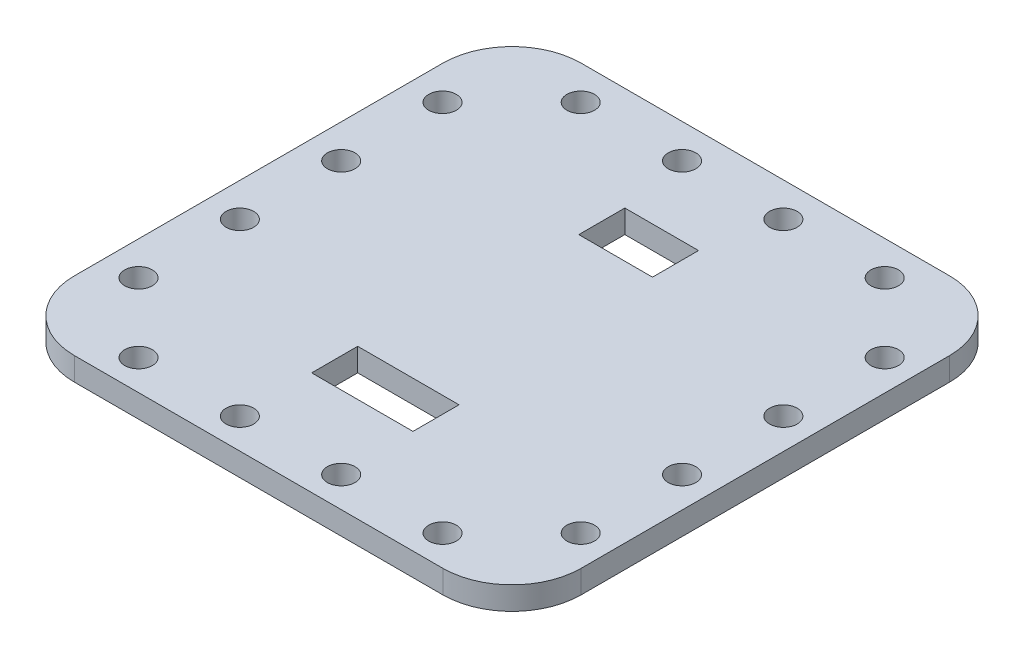
ISO-10303-21;
HEADER;
FILE_DESCRIPTION(('STEP AP214'),'2;1');
FILE_NAME('part.step','',(''),(''),'','','');
FILE_SCHEMA(('AUTOMOTIVE_DESIGN { 1 0 10303 214 1 1 1 1 }'));
ENDSEC;
DATA;
#1=APPLICATION_CONTEXT('core data for automotive mechanical design processes');
#2=APPLICATION_PROTOCOL_DEFINITION('international standard','automotive_design',2000,#1);
#3=PRODUCT_CONTEXT('',#1,'mechanical');
#4=PRODUCT('Part','Part','',(#3));
#5=PRODUCT_RELATED_PRODUCT_CATEGORY('part','',(#4));
#6=PRODUCT_DEFINITION_FORMATION('','',#4);
#7=PRODUCT_DEFINITION_CONTEXT('part definition',#1,'design');
#8=PRODUCT_DEFINITION('design','',#6,#7);
#9=PRODUCT_DEFINITION_SHAPE('','',#8);
#10=(LENGTH_UNIT() NAMED_UNIT(*) SI_UNIT(.MILLI.,.METRE.));
#11=(NAMED_UNIT(*) PLANE_ANGLE_UNIT() SI_UNIT($,.RADIAN.));
#12=(NAMED_UNIT(*) SI_UNIT($,.STERADIAN.) SOLID_ANGLE_UNIT());
#13=UNCERTAINTY_MEASURE_WITH_UNIT(LENGTH_MEASURE(1.E-05),#10,'distance_accuracy_value','');
#14=(GEOMETRIC_REPRESENTATION_CONTEXT(3) GLOBAL_UNCERTAINTY_ASSIGNED_CONTEXT((#13)) GLOBAL_UNIT_ASSIGNED_CONTEXT((#10,
#11,#12)) REPRESENTATION_CONTEXT('',''));
#15=CARTESIAN_POINT('',(0.,0.,0.));
#16=DIRECTION('',(0.,0.,1.));
#17=DIRECTION('',(1.,0.,0.));
#18=AXIS2_PLACEMENT_3D('',#15,#16,#17);
#19=CARTESIAN_POINT('',(40.,5.,55.));
#20=DIRECTION('',(0.,1.,0.));
#21=DIRECTION('',(0.,0.,1.));
#22=AXIS2_PLACEMENT_3D('',#19,#20,#21);
#23=PLANE('',#22);
#24=DIRECTION('',(0.,0.,1.));
#25=VECTOR('',#24,1.);
#26=CARTESIAN_POINT('',(-11.,5.,22.5));
#27=LINE('',#26,#25);
#28=CARTESIAN_POINT('',(-11.,5.,22.5));
#29=VERTEX_POINT('',#28);
#30=CARTESIAN_POINT('',(-11.,5.,32.5));
#31=VERTEX_POINT('',#30);
#32=EDGE_CURVE('E57',#29,#31,#27,.T.);
#33=ORIENTED_EDGE('',*,*,#32,.F.);
#34=DIRECTION('',(-1.,0.,0.));
#35=VECTOR('',#34,1.);
#36=CARTESIAN_POINT('',(-11.,5.,22.5));
#37=LINE('',#36,#35);
#38=CARTESIAN_POINT('',(11.,5.,22.5));
#39=VERTEX_POINT('',#38);
#40=EDGE_CURVE('E173',#39,#29,#37,.T.);
#41=ORIENTED_EDGE('',*,*,#40,.F.);
#42=DIRECTION('',(0.,0.,-1.));
#43=VECTOR('',#42,1.);
#44=CARTESIAN_POINT('',(11.,5.,22.5));
#45=LINE('',#44,#43);
#46=CARTESIAN_POINT('',(11.,5.,32.5));
#47=VERTEX_POINT('',#46);
#48=EDGE_CURVE('E176',#47,#39,#45,.T.);
#49=ORIENTED_EDGE('',*,*,#48,.F.);
#50=DIRECTION('',(1.,0.,0.));
#51=VECTOR('',#50,1.);
#52=CARTESIAN_POINT('',(-11.,5.,32.5));
#53=LINE('',#52,#51);
#54=EDGE_CURVE('E182',#31,#47,#53,.T.);
#55=ORIENTED_EDGE('',*,*,#54,.F.);
#56=EDGE_LOOP('',(#33,#41,#49,#55));
#57=FACE_BOUND('',#56,.T.);
#58=DIRECTION('',(0.,0.,1.));
#59=VECTOR('',#58,1.);
#60=CARTESIAN_POINT('',(-7.99999999999998,5.,-32.5));
#61=LINE('',#60,#59);
#62=CARTESIAN_POINT('',(-7.99999999999998,5.,-32.5));
#63=VERTEX_POINT('',#62);
#64=CARTESIAN_POINT('',(-7.99999999999997,5.,-22.5));
#65=VERTEX_POINT('',#64);
#66=EDGE_CURVE('E188',#63,#65,#61,.T.);
#67=ORIENTED_EDGE('',*,*,#66,.F.);
#68=DIRECTION('',(-1.,0.,0.));
#69=VECTOR('',#68,1.);
#70=CARTESIAN_POINT('',(-7.99999999999998,5.,-32.5));
#71=LINE('',#70,#69);
#72=CARTESIAN_POINT('',(8.00000000000002,5.,-32.5));
#73=VERTEX_POINT('',#72);
#74=EDGE_CURVE('E196',#73,#63,#71,.T.);
#75=ORIENTED_EDGE('',*,*,#74,.F.);
#76=DIRECTION('',(0.,0.,-1.));
#77=VECTOR('',#76,1.);
#78=CARTESIAN_POINT('',(8.00000000000002,5.,-32.5));
#79=LINE('',#78,#77);
#80=CARTESIAN_POINT('',(8.00000000000002,5.,-22.5));
#81=VERTEX_POINT('',#80);
#82=EDGE_CURVE('E210',#81,#73,#79,.T.);
#83=ORIENTED_EDGE('',*,*,#82,.F.);
#84=DIRECTION('',(1.,0.,0.));
#85=VECTOR('',#84,1.);
#86=CARTESIAN_POINT('',(-7.99999999999998,5.,-22.5));
#87=LINE('',#86,#85);
#88=EDGE_CURVE('E207',#65,#81,#87,.T.);
#89=ORIENTED_EDGE('',*,*,#88,.F.);
#90=EDGE_LOOP('',(#67,#75,#83,#89));
#91=FACE_BOUND('',#90,.T.);
#92=CARTESIAN_POINT('',(48.3346963055934,5.,-10.5816296180082));
#93=DIRECTION('',(0.,-1.,0.));
#94=DIRECTION('',(0.,0.,-1.));
#95=AXIS2_PLACEMENT_3D('',#92,#93,#94);
#96=CIRCLE('',#95,3.00000000000002);
#97=CARTESIAN_POINT('',(48.3346963055934,5.,-13.5816296180082));
#98=VERTEX_POINT('',#97);
#99=EDGE_CURVE('E277',#98,#98,#96,.T.);
#100=ORIENTED_EDGE('',*,*,#99,.T.);
#101=EDGE_LOOP('',(#100));
#102=FACE_BOUND('',#101,.T.);
#103=CARTESIAN_POINT('',(-32.6653036944065,5.,-47.5816296180083));
#104=DIRECTION('',(0.,-1.,0.));
#105=DIRECTION('',(0.,0.,-1.));
#106=AXIS2_PLACEMENT_3D('',#103,#104,#105);
#107=CIRCLE('',#106,3.00000000000001);
#108=CARTESIAN_POINT('',(-32.6653036944065,5.,-50.5816296180083));
#109=VERTEX_POINT('',#108);
#110=EDGE_CURVE('E289',#109,#109,#107,.T.);
#111=ORIENTED_EDGE('',*,*,#110,.T.);
#112=EDGE_LOOP('',(#111));
#113=FACE_BOUND('',#112,.T.);
#114=CARTESIAN_POINT('',(-47.6653036944066,5.,-32.5816296180082));
#115=DIRECTION('',(0.,-1.,0.));
#116=DIRECTION('',(0.,0.,-1.));
#117=AXIS2_PLACEMENT_3D('',#114,#115,#116);
#118=CIRCLE('',#117,3.);
#119=CARTESIAN_POINT('',(-47.6653036944066,5.,-35.5816296180082));
#120=VERTEX_POINT('',#119);
#121=EDGE_CURVE('E292',#120,#120,#118,.T.);
#122=ORIENTED_EDGE('',*,*,#121,.T.);
#123=EDGE_LOOP('',(#122));
#124=FACE_BOUND('',#123,.T.);
#125=CARTESIAN_POINT('',(-47.6653036944066,5.,-10.5816296180082));
#126=DIRECTION('',(0.,-1.,0.));
#127=DIRECTION('',(0.,0.,-1.));
#128=AXIS2_PLACEMENT_3D('',#125,#126,#127);
#129=CIRCLE('',#128,3.00000000000003);
#130=CARTESIAN_POINT('',(-47.6653036944066,5.,-13.5816296180083));
#131=VERTEX_POINT('',#130);
#132=EDGE_CURVE('E295',#131,#131,#129,.T.);
#133=ORIENTED_EDGE('',*,*,#132,.T.);
#134=EDGE_LOOP('',(#133));
#135=FACE_BOUND('',#134,.T.);
#136=CARTESIAN_POINT('',(-47.6653036944066,5.,11.4183703819918));
#137=DIRECTION('',(0.,-1.,0.));
#138=DIRECTION('',(0.,0.,-1.));
#139=AXIS2_PLACEMENT_3D('',#136,#137,#138);
#140=CIRCLE('',#139,2.99999999999997);
#141=CARTESIAN_POINT('',(-47.6653036944066,5.,8.4183703819918));
#142=VERTEX_POINT('',#141);
#143=EDGE_CURVE('E298',#142,#142,#140,.T.);
#144=ORIENTED_EDGE('',*,*,#143,.T.);
#145=EDGE_LOOP('',(#144));
#146=FACE_BOUND('',#145,.T.);
#147=CARTESIAN_POINT('',(-10.6653036944066,5.,48.4183703819918));
#148=DIRECTION('',(0.,-1.,0.));
#149=DIRECTION('',(0.,0.,-1.));
#150=AXIS2_PLACEMENT_3D('',#147,#148,#149);
#151=CIRCLE('',#150,3.00000000000002);
#152=CARTESIAN_POINT('',(-10.6653036944066,5.,45.4183703819917));
#153=VERTEX_POINT('',#152);
#154=EDGE_CURVE('E301',#153,#153,#151,.T.);
#155=ORIENTED_EDGE('',*,*,#154,.T.);
#156=EDGE_LOOP('',(#155));
#157=FACE_BOUND('',#156,.T.);
#158=CARTESIAN_POINT('',(11.3346963055934,5.,48.4183703819918));
#159=DIRECTION('',(0.,-1.,0.));
#160=DIRECTION('',(0.,0.,-1.));
#161=AXIS2_PLACEMENT_3D('',#158,#159,#160);
#162=CIRCLE('',#161,2.99999999999997);
#163=CARTESIAN_POINT('',(11.3346963055934,5.,45.4183703819918));
#164=VERTEX_POINT('',#163);
#165=EDGE_CURVE('E304',#164,#164,#162,.T.);
#166=ORIENTED_EDGE('',*,*,#165,.T.);
#167=EDGE_LOOP('',(#166));
#168=FACE_BOUND('',#167,.T.);
#169=CARTESIAN_POINT('',(33.3346963055934,5.,48.4183703819918));
#170=DIRECTION('',(0.,-1.,0.));
#171=DIRECTION('',(0.,0.,-1.));
#172=AXIS2_PLACEMENT_3D('',#169,#170,#171);
#173=CIRCLE('',#172,3.00000000000001);
#174=CARTESIAN_POINT('',(33.3346963055934,5.,45.4183703819917));
#175=VERTEX_POINT('',#174);
#176=EDGE_CURVE('E307',#175,#175,#173,.T.);
#177=ORIENTED_EDGE('',*,*,#176,.T.);
#178=EDGE_LOOP('',(#177));
#179=FACE_BOUND('',#178,.T.);
#180=CARTESIAN_POINT('',(48.3346963055934,5.,11.4183703819918));
#181=DIRECTION('',(0.,-1.,0.));
#182=DIRECTION('',(0.,0.,-1.));
#183=AXIS2_PLACEMENT_3D('',#180,#181,#182);
#184=CIRCLE('',#183,2.99999999999997);
#185=CARTESIAN_POINT('',(48.3346963055934,5.,8.4183703819918));
#186=VERTEX_POINT('',#185);
#187=EDGE_CURVE('E310',#186,#186,#184,.T.);
#188=ORIENTED_EDGE('',*,*,#187,.T.);
#189=EDGE_LOOP('',(#188));
#190=FACE_BOUND('',#189,.T.);
#191=CARTESIAN_POINT('',(48.3346963055935,5.,-32.5816296180082));
#192=DIRECTION('',(0.,-1.,0.));
#193=DIRECTION('',(0.,0.,-1.));
#194=AXIS2_PLACEMENT_3D('',#191,#192,#193);
#195=CIRCLE('',#194,3.00000000000001);
#196=CARTESIAN_POINT('',(48.3346963055935,5.,-35.5816296180082));
#197=VERTEX_POINT('',#196);
#198=EDGE_CURVE('E313',#197,#197,#195,.T.);
#199=ORIENTED_EDGE('',*,*,#198,.T.);
#200=EDGE_LOOP('',(#199));
#201=FACE_BOUND('',#200,.T.);
#202=CARTESIAN_POINT('',(33.3346963055935,5.,-47.5816296180082));
#203=DIRECTION('',(0.,-1.,0.));
#204=DIRECTION('',(0.,0.,-1.));
#205=AXIS2_PLACEMENT_3D('',#202,#203,#204);
#206=CIRCLE('',#205,2.99999999999997);
#207=CARTESIAN_POINT('',(33.3346963055935,5.,-50.5816296180082));
#208=VERTEX_POINT('',#207);
#209=EDGE_CURVE('E316',#208,#208,#206,.T.);
#210=ORIENTED_EDGE('',*,*,#209,.T.);
#211=EDGE_LOOP('',(#210));
#212=FACE_BOUND('',#211,.T.);
#213=CARTESIAN_POINT('',(11.3346963055935,5.,-47.5816296180082));
#214=DIRECTION('',(0.,-1.,0.));
#215=DIRECTION('',(0.,0.,-1.));
#216=AXIS2_PLACEMENT_3D('',#213,#214,#215);
#217=CIRCLE('',#216,2.99999999999997);
#218=CARTESIAN_POINT('',(11.3346963055935,5.,-50.5816296180082));
#219=VERTEX_POINT('',#218);
#220=EDGE_CURVE('E319',#219,#219,#217,.T.);
#221=ORIENTED_EDGE('',*,*,#220,.T.);
#222=EDGE_LOOP('',(#221));
#223=FACE_BOUND('',#222,.T.);
#224=CARTESIAN_POINT('',(-10.6653036944065,5.,-47.5816296180082));
#225=DIRECTION('',(0.,-1.,0.));
#226=DIRECTION('',(0.,0.,-1.));
#227=AXIS2_PLACEMENT_3D('',#224,#225,#226);
#228=CIRCLE('',#227,3.00000000000002);
#229=CARTESIAN_POINT('',(-10.6653036944065,5.,-50.5816296180083));
#230=VERTEX_POINT('',#229);
#231=EDGE_CURVE('E322',#230,#230,#228,.T.);
#232=ORIENTED_EDGE('',*,*,#231,.T.);
#233=EDGE_LOOP('',(#232));
#234=FACE_BOUND('',#233,.T.);
#235=CARTESIAN_POINT('',(-47.6653036944065,5.,33.4183703819918));
#236=DIRECTION('',(0.,-1.,0.));
#237=DIRECTION('',(0.,0.,-1.));
#238=AXIS2_PLACEMENT_3D('',#235,#236,#237);
#239=CIRCLE('',#238,3.);
#240=CARTESIAN_POINT('',(-47.6653036944065,5.,30.4183703819918));
#241=VERTEX_POINT('',#240);
#242=EDGE_CURVE('E325',#241,#241,#239,.T.);
#243=ORIENTED_EDGE('',*,*,#242,.T.);
#244=EDGE_LOOP('',(#243));
#245=FACE_BOUND('',#244,.T.);
#246=CARTESIAN_POINT('',(-32.6653036944065,5.,48.4183703819918));
#247=DIRECTION('',(0.,-1.,0.));
#248=DIRECTION('',(0.,0.,-1.));
#249=AXIS2_PLACEMENT_3D('',#246,#247,#248);
#250=CIRCLE('',#249,3.00000000000001);
#251=CARTESIAN_POINT('',(-32.6653036944065,5.,45.4183703819918));
#252=VERTEX_POINT('',#251);
#253=EDGE_CURVE('E328',#252,#252,#250,.T.);
#254=ORIENTED_EDGE('',*,*,#253,.T.);
#255=EDGE_LOOP('',(#254));
#256=FACE_BOUND('',#255,.T.);
#257=CARTESIAN_POINT('',(48.3346963055934,5.,33.4183703819918));
#258=DIRECTION('',(0.,-1.,0.));
#259=DIRECTION('',(0.,0.,-1.));
#260=AXIS2_PLACEMENT_3D('',#257,#258,#259);
#261=CIRCLE('',#260,3.00000000000001);
#262=CARTESIAN_POINT('',(48.3346963055934,5.,30.4183703819918));
#263=VERTEX_POINT('',#262);
#264=EDGE_CURVE('E331',#263,#263,#261,.T.);
#265=ORIENTED_EDGE('',*,*,#264,.T.);
#266=EDGE_LOOP('',(#265));
#267=FACE_BOUND('',#266,.T.);
#268=DIRECTION('',(1.,0.,0.));
#269=VECTOR('',#268,1.);
#270=CARTESIAN_POINT('',(-55.,5.,55.));
#271=LINE('',#270,#269);
#272=CARTESIAN_POINT('',(-40.,5.,55.));
#273=VERTEX_POINT('',#272);
#274=CARTESIAN_POINT('',(40.,5.,55.));
#275=VERTEX_POINT('',#274);
#276=EDGE_CURVE('E264',#273,#275,#271,.T.);
#277=ORIENTED_EDGE('',*,*,#276,.T.);
#278=CARTESIAN_POINT('',(40.,5.,40.));
#279=DIRECTION('',(0.,-1.,0.));
#280=DIRECTION('',(0.,0.,-1.));
#281=AXIS2_PLACEMENT_3D('',#278,#279,#280);
#282=CIRCLE('',#281,15.);
#283=CARTESIAN_POINT('',(55.,5.,40.));
#284=VERTEX_POINT('',#283);
#285=EDGE_CURVE('E217',#275,#284,#282,.F.);
#286=ORIENTED_EDGE('',*,*,#285,.T.);
#287=DIRECTION('',(0.,0.,-1.));
#288=VECTOR('',#287,1.);
#289=CARTESIAN_POINT('',(55.,5.,55.));
#290=LINE('',#289,#288);
#291=CARTESIAN_POINT('',(55.,5.,-40.));
#292=VERTEX_POINT('',#291);
#293=EDGE_CURVE('E269',#284,#292,#290,.T.);
#294=ORIENTED_EDGE('',*,*,#293,.T.);
#295=CARTESIAN_POINT('',(40.,5.,-40.));
#296=DIRECTION('',(0.,-1.,0.));
#297=DIRECTION('',(0.,0.,-1.));
#298=AXIS2_PLACEMENT_3D('',#295,#296,#297);
#299=CIRCLE('',#298,15.);
#300=CARTESIAN_POINT('',(40.,5.,-55.));
#301=VERTEX_POINT('',#300);
#302=EDGE_CURVE('E253',#292,#301,#299,.F.);
#303=ORIENTED_EDGE('',*,*,#302,.T.);
#304=DIRECTION('',(-1.,0.,0.));
#305=VECTOR('',#304,1.);
#306=CARTESIAN_POINT('',(-55.,5.,-55.));
#307=LINE('',#306,#305);
#308=CARTESIAN_POINT('',(-40.,5.,-55.));
#309=VERTEX_POINT('',#308);
#310=EDGE_CURVE('E283',#301,#309,#307,.T.);
#311=ORIENTED_EDGE('',*,*,#310,.T.);
#312=CARTESIAN_POINT('',(-40.,5.,-40.));
#313=DIRECTION('',(0.,-1.,0.));
#314=DIRECTION('',(0.,0.,-1.));
#315=AXIS2_PLACEMENT_3D('',#312,#313,#314);
#316=CIRCLE('',#315,15.);
#317=CARTESIAN_POINT('',(-55.,5.,-40.));
#318=VERTEX_POINT('',#317);
#319=EDGE_CURVE('E243',#309,#318,#316,.F.);
#320=ORIENTED_EDGE('',*,*,#319,.T.);
#321=DIRECTION('',(0.,0.,1.));
#322=VECTOR('',#321,1.);
#323=CARTESIAN_POINT('',(-55.,5.,55.));
#324=LINE('',#323,#322);
#325=CARTESIAN_POINT('',(-55.,5.,40.));
#326=VERTEX_POINT('',#325);
#327=EDGE_CURVE('E280',#318,#326,#324,.T.);
#328=ORIENTED_EDGE('',*,*,#327,.T.);
#329=CARTESIAN_POINT('',(-40.,5.,40.));
#330=DIRECTION('',(0.,-1.,0.));
#331=DIRECTION('',(0.,0.,-1.));
#332=AXIS2_PLACEMENT_3D('',#329,#330,#331);
#333=CIRCLE('',#332,15.);
#334=EDGE_CURVE('E233',#326,#273,#333,.F.);
#335=ORIENTED_EDGE('',*,*,#334,.T.);
#336=EDGE_LOOP('',(#277,#286,#294,#303,#311,#320,#328,#335));
#337=FACE_BOUND('',#336,.T.);
#338=ADVANCED_FACE('F41',(#57,#91,#102,#113,#124,#135,#146,#157,#168,#179,#190,#201,#212,#223,
#234,#245,#256,#267,#337),#23,.T.);
#339=CARTESIAN_POINT('',(40.,5.,-40.));
#340=DIRECTION('',(0.,1.,0.));
#341=DIRECTION('',(0.,0.,1.));
#342=AXIS2_PLACEMENT_3D('',#339,#340,#341);
#343=CYLINDRICAL_SURFACE('',#342,15.);
#344=DIRECTION('',(0.,1.,0.));
#345=VECTOR('',#344,1.);
#346=CARTESIAN_POINT('',(55.,5.,-40.));
#347=LINE('',#346,#345);
#348=CARTESIAN_POINT('',(55.,0.,-40.));
#349=VERTEX_POINT('',#348);
#350=EDGE_CURVE('E261',#349,#292,#347,.T.);
#351=ORIENTED_EDGE('',*,*,#350,.F.);
#352=CARTESIAN_POINT('',(40.,0.,-40.));
#353=DIRECTION('',(0.,-1.,0.));
#354=DIRECTION('',(0.,0.,-1.));
#355=AXIS2_PLACEMENT_3D('',#352,#353,#354);
#356=CIRCLE('',#355,15.);
#357=CARTESIAN_POINT('',(40.,0.,-55.));
#358=VERTEX_POINT('',#357);
#359=EDGE_CURVE('E255',#358,#349,#356,.T.);
#360=ORIENTED_EDGE('',*,*,#359,.F.);
#361=DIRECTION('',(0.,1.,0.));
#362=VECTOR('',#361,1.);
#363=CARTESIAN_POINT('',(40.,5.,-55.));
#364=LINE('',#363,#362);
#365=EDGE_CURVE('E258',#301,#358,#364,.F.);
#366=ORIENTED_EDGE('',*,*,#365,.F.);
#367=ORIENTED_EDGE('',*,*,#302,.F.);
#368=EDGE_LOOP('',(#351,#360,#366,#367));
#369=FACE_BOUND('',#368,.T.);
#370=ADVANCED_FACE('F430',(#369),#343,.T.);
#371=CARTESIAN_POINT('',(-40.,5.,-40.));
#372=DIRECTION('',(0.,1.,0.));
#373=DIRECTION('',(0.,0.,1.));
#374=AXIS2_PLACEMENT_3D('',#371,#372,#373);
#375=CYLINDRICAL_SURFACE('',#374,15.);
#376=DIRECTION('',(0.,1.,0.));
#377=VECTOR('',#376,1.);
#378=CARTESIAN_POINT('',(-40.,5.,-55.));
#379=LINE('',#378,#377);
#380=CARTESIAN_POINT('',(-40.,0.,-55.));
#381=VERTEX_POINT('',#380);
#382=EDGE_CURVE('E250',#381,#309,#379,.T.);
#383=ORIENTED_EDGE('',*,*,#382,.F.);
#384=CARTESIAN_POINT('',(-40.,0.,-40.));
#385=DIRECTION('',(0.,-1.,0.));
#386=DIRECTION('',(0.,0.,-1.));
#387=AXIS2_PLACEMENT_3D('',#384,#385,#386);
#388=CIRCLE('',#387,15.);
#389=CARTESIAN_POINT('',(-55.,0.,-40.));
#390=VERTEX_POINT('',#389);
#391=EDGE_CURVE('E245',#390,#381,#388,.T.);
#392=ORIENTED_EDGE('',*,*,#391,.F.);
#393=DIRECTION('',(0.,1.,0.));
#394=VECTOR('',#393,1.);
#395=CARTESIAN_POINT('',(-55.,5.,-40.));
#396=LINE('',#395,#394);
#397=EDGE_CURVE('E247',#318,#390,#396,.F.);
#398=ORIENTED_EDGE('',*,*,#397,.F.);
#399=ORIENTED_EDGE('',*,*,#319,.F.);
#400=EDGE_LOOP('',(#383,#392,#398,#399));
#401=FACE_BOUND('',#400,.T.);
#402=ADVANCED_FACE('F423',(#401),#375,.T.);
#403=CARTESIAN_POINT('',(-40.,5.,40.));
#404=DIRECTION('',(0.,1.,0.));
#405=DIRECTION('',(0.,0.,1.));
#406=AXIS2_PLACEMENT_3D('',#403,#404,#405);
#407=CYLINDRICAL_SURFACE('',#406,15.);
#408=DIRECTION('',(0.,1.,0.));
#409=VECTOR('',#408,1.);
#410=CARTESIAN_POINT('',(-55.,5.,40.));
#411=LINE('',#410,#409);
#412=CARTESIAN_POINT('',(-55.,0.,40.));
#413=VERTEX_POINT('',#412);
#414=EDGE_CURVE('E240',#413,#326,#411,.T.);
#415=ORIENTED_EDGE('',*,*,#414,.F.);
#416=CARTESIAN_POINT('',(-40.,0.,40.));
#417=DIRECTION('',(0.,-1.,0.));
#418=DIRECTION('',(0.,0.,-1.));
#419=AXIS2_PLACEMENT_3D('',#416,#417,#418);
#420=CIRCLE('',#419,15.);
#421=CARTESIAN_POINT('',(-40.,0.,55.));
#422=VERTEX_POINT('',#421);
#423=EDGE_CURVE('E235',#422,#413,#420,.T.);
#424=ORIENTED_EDGE('',*,*,#423,.F.);
#425=DIRECTION('',(0.,1.,0.));
#426=VECTOR('',#425,1.);
#427=CARTESIAN_POINT('',(-40.,5.,55.));
#428=LINE('',#427,#426);
#429=EDGE_CURVE('E237',#273,#422,#428,.F.);
#430=ORIENTED_EDGE('',*,*,#429,.F.);
#431=ORIENTED_EDGE('',*,*,#334,.F.);
#432=EDGE_LOOP('',(#415,#424,#430,#431));
#433=FACE_BOUND('',#432,.T.);
#434=ADVANCED_FACE('F416',(#433),#407,.T.);
#435=CARTESIAN_POINT('',(40.,5.,40.));
#436=DIRECTION('',(0.,1.,0.));
#437=DIRECTION('',(0.,0.,1.));
#438=AXIS2_PLACEMENT_3D('',#435,#436,#437);
#439=CYLINDRICAL_SURFACE('',#438,15.);
#440=DIRECTION('',(0.,1.,0.));
#441=VECTOR('',#440,1.);
#442=CARTESIAN_POINT('',(40.,5.,55.));
#443=LINE('',#442,#441);
#444=CARTESIAN_POINT('',(40.,0.,55.));
#445=VERTEX_POINT('',#444);
#446=EDGE_CURVE('E230',#445,#275,#443,.T.);
#447=ORIENTED_EDGE('',*,*,#446,.F.);
#448=CARTESIAN_POINT('',(40.,0.,40.));
#449=DIRECTION('',(0.,-1.,0.));
#450=DIRECTION('',(0.,0.,-1.));
#451=AXIS2_PLACEMENT_3D('',#448,#449,#450);
#452=CIRCLE('',#451,15.);
#453=CARTESIAN_POINT('',(55.,0.,40.));
#454=VERTEX_POINT('',#453);
#455=EDGE_CURVE('E225',#454,#445,#452,.T.);
#456=ORIENTED_EDGE('',*,*,#455,.F.);
#457=DIRECTION('',(0.,1.,0.));
#458=VECTOR('',#457,1.);
#459=CARTESIAN_POINT('',(55.,5.,40.));
#460=LINE('',#459,#458);
#461=EDGE_CURVE('E227',#284,#454,#460,.F.);
#462=ORIENTED_EDGE('',*,*,#461,.F.);
#463=ORIENTED_EDGE('',*,*,#285,.F.);
#464=EDGE_LOOP('',(#447,#456,#462,#463));
#465=FACE_BOUND('',#464,.T.);
#466=ADVANCED_FACE('F384',(#465),#439,.T.);
#467=CARTESIAN_POINT('',(0.,0.,0.));
#468=DIRECTION('',(0.,-1.,0.));
#469=DIRECTION('',(0.,0.,-1.));
#470=AXIS2_PLACEMENT_3D('',#467,#468,#469);
#471=PLANE('',#470);
#472=DIRECTION('',(0.,0.,1.));
#473=VECTOR('',#472,1.);
#474=CARTESIAN_POINT('',(-11.,0.,22.5));
#475=LINE('',#474,#473);
#476=CARTESIAN_POINT('',(-11.,0.,22.5));
#477=VERTEX_POINT('',#476);
#478=CARTESIAN_POINT('',(-11.,0.,32.5));
#479=VERTEX_POINT('',#478);
#480=EDGE_CURVE('E157',#477,#479,#475,.T.);
#481=ORIENTED_EDGE('',*,*,#480,.T.);
#482=DIRECTION('',(1.,0.,0.));
#483=VECTOR('',#482,1.);
#484=CARTESIAN_POINT('',(-11.,0.,32.5));
#485=LINE('',#484,#483);
#486=CARTESIAN_POINT('',(11.,0.,32.5));
#487=VERTEX_POINT('',#486);
#488=EDGE_CURVE('E166',#479,#487,#485,.T.);
#489=ORIENTED_EDGE('',*,*,#488,.T.);
#490=DIRECTION('',(0.,0.,-1.));
#491=VECTOR('',#490,1.);
#492=CARTESIAN_POINT('',(11.,0.,22.5));
#493=LINE('',#492,#491);
#494=CARTESIAN_POINT('',(11.,0.,22.5));
#495=VERTEX_POINT('',#494);
#496=EDGE_CURVE('E65',#487,#495,#493,.T.);
#497=ORIENTED_EDGE('',*,*,#496,.T.);
#498=DIRECTION('',(-1.,0.,0.));
#499=VECTOR('',#498,1.);
#500=CARTESIAN_POINT('',(-11.,0.,22.5));
#501=LINE('',#500,#499);
#502=EDGE_CURVE('E163',#495,#477,#501,.T.);
#503=ORIENTED_EDGE('',*,*,#502,.T.);
#504=EDGE_LOOP('',(#481,#489,#497,#503));
#505=FACE_BOUND('',#504,.T.);
#506=DIRECTION('',(0.,0.,1.));
#507=VECTOR('',#506,1.);
#508=CARTESIAN_POINT('',(-7.99999999999998,0.,-32.5));
#509=LINE('',#508,#507);
#510=CARTESIAN_POINT('',(-7.99999999999998,0.,-32.5));
#511=VERTEX_POINT('',#510);
#512=CARTESIAN_POINT('',(-7.99999999999998,0.,-22.5));
#513=VERTEX_POINT('',#512);
#514=EDGE_CURVE('E192',#511,#513,#509,.T.);
#515=ORIENTED_EDGE('',*,*,#514,.T.);
#516=DIRECTION('',(1.,0.,0.));
#517=VECTOR('',#516,1.);
#518=CARTESIAN_POINT('',(-7.99999999999998,0.,-22.5));
#519=LINE('',#518,#517);
#520=CARTESIAN_POINT('',(8.00000000000002,0.,-22.5));
#521=VERTEX_POINT('',#520);
#522=EDGE_CURVE('E195',#513,#521,#519,.T.);
#523=ORIENTED_EDGE('',*,*,#522,.T.);
#524=DIRECTION('',(0.,0.,-1.));
#525=VECTOR('',#524,1.);
#526=CARTESIAN_POINT('',(8.00000000000002,0.,-32.5));
#527=LINE('',#526,#525);
#528=CARTESIAN_POINT('',(8.00000000000002,0.,-32.5));
#529=VERTEX_POINT('',#528);
#530=EDGE_CURVE('E199',#521,#529,#527,.T.);
#531=ORIENTED_EDGE('',*,*,#530,.T.);
#532=DIRECTION('',(-1.,0.,0.));
#533=VECTOR('',#532,1.);
#534=CARTESIAN_POINT('',(-7.99999999999998,0.,-32.5));
#535=LINE('',#534,#533);
#536=EDGE_CURVE('E202',#529,#511,#535,.T.);
#537=ORIENTED_EDGE('',*,*,#536,.T.);
#538=EDGE_LOOP('',(#515,#523,#531,#537));
#539=FACE_BOUND('',#538,.T.);
#540=CARTESIAN_POINT('',(48.3346963055934,0.,-10.5816296180082));
#541=DIRECTION('',(0.,-1.,0.));
#542=DIRECTION('',(0.,0.,-1.));
#543=AXIS2_PLACEMENT_3D('',#540,#541,#542);
#544=CIRCLE('',#543,3.00000000000002);
#545=CARTESIAN_POINT('',(48.3346963055934,0.,-13.5816296180082));
#546=VERTEX_POINT('',#545);
#547=EDGE_CURVE('E337',#546,#546,#544,.T.);
#548=ORIENTED_EDGE('',*,*,#547,.F.);
#549=EDGE_LOOP('',(#548));
#550=FACE_BOUND('',#549,.T.);
#551=CARTESIAN_POINT('',(-32.6653036944065,0.,-47.5816296180083));
#552=DIRECTION('',(0.,-1.,0.));
#553=DIRECTION('',(0.,0.,-1.));
#554=AXIS2_PLACEMENT_3D('',#551,#552,#553);
#555=CIRCLE('',#554,3.00000000000001);
#556=CARTESIAN_POINT('',(-32.6653036944065,0.,-50.5816296180083));
#557=VERTEX_POINT('',#556);
#558=EDGE_CURVE('E356',#557,#557,#555,.T.);
#559=ORIENTED_EDGE('',*,*,#558,.F.);
#560=EDGE_LOOP('',(#559));
#561=FACE_BOUND('',#560,.T.);
#562=CARTESIAN_POINT('',(-47.6653036944066,0.,-32.5816296180082));
#563=DIRECTION('',(0.,-1.,0.));
#564=DIRECTION('',(0.,0.,-1.));
#565=AXIS2_PLACEMENT_3D('',#562,#563,#564);
#566=CIRCLE('',#565,3.);
#567=CARTESIAN_POINT('',(-47.6653036944066,0.,-35.5816296180082));
#568=VERTEX_POINT('',#567);
#569=EDGE_CURVE('E353',#568,#568,#566,.T.);
#570=ORIENTED_EDGE('',*,*,#569,.F.);
#571=EDGE_LOOP('',(#570));
#572=FACE_BOUND('',#571,.T.);
#573=CARTESIAN_POINT('',(-47.6653036944066,0.,-10.5816296180082));
#574=DIRECTION('',(0.,-1.,0.));
#575=DIRECTION('',(0.,0.,-1.));
#576=AXIS2_PLACEMENT_3D('',#573,#574,#575);
#577=CIRCLE('',#576,3.00000000000003);
#578=CARTESIAN_POINT('',(-47.6653036944066,0.,-13.5816296180083));
#579=VERTEX_POINT('',#578);
#580=EDGE_CURVE('E350',#579,#579,#577,.T.);
#581=ORIENTED_EDGE('',*,*,#580,.F.);
#582=EDGE_LOOP('',(#581));
#583=FACE_BOUND('',#582,.T.);
#584=CARTESIAN_POINT('',(-47.6653036944066,0.,11.4183703819918));
#585=DIRECTION('',(0.,-1.,0.));
#586=DIRECTION('',(0.,0.,-1.));
#587=AXIS2_PLACEMENT_3D('',#584,#585,#586);
#588=CIRCLE('',#587,2.99999999999997);
#589=CARTESIAN_POINT('',(-47.6653036944066,0.,8.4183703819918));
#590=VERTEX_POINT('',#589);
#591=EDGE_CURVE('E347',#590,#590,#588,.T.);
#592=ORIENTED_EDGE('',*,*,#591,.F.);
#593=EDGE_LOOP('',(#592));
#594=FACE_BOUND('',#593,.T.);
#595=CARTESIAN_POINT('',(-10.6653036944066,0.,48.4183703819918));
#596=DIRECTION('',(0.,-1.,0.));
#597=DIRECTION('',(0.,0.,-1.));
#598=AXIS2_PLACEMENT_3D('',#595,#596,#597);
#599=CIRCLE('',#598,3.00000000000002);
#600=CARTESIAN_POINT('',(-10.6653036944066,0.,45.4183703819917));
#601=VERTEX_POINT('',#600);
#602=EDGE_CURVE('E344',#601,#601,#599,.T.);
#603=ORIENTED_EDGE('',*,*,#602,.F.);
#604=EDGE_LOOP('',(#603));
#605=FACE_BOUND('',#604,.T.);
#606=CARTESIAN_POINT('',(11.3346963055934,0.,48.4183703819918));
#607=DIRECTION('',(0.,-1.,0.));
#608=DIRECTION('',(0.,0.,-1.));
#609=AXIS2_PLACEMENT_3D('',#606,#607,#608);
#610=CIRCLE('',#609,2.99999999999997);
#611=CARTESIAN_POINT('',(11.3346963055934,0.,45.4183703819918));
#612=VERTEX_POINT('',#611);
#613=EDGE_CURVE('E341',#612,#612,#610,.T.);
#614=ORIENTED_EDGE('',*,*,#613,.F.);
#615=EDGE_LOOP('',(#614));
#616=FACE_BOUND('',#615,.T.);
#617=CARTESIAN_POINT('',(33.3346963055934,0.,48.4183703819918));
#618=DIRECTION('',(0.,-1.,0.));
#619=DIRECTION('',(0.,0.,-1.));
#620=AXIS2_PLACEMENT_3D('',#617,#618,#619);
#621=CIRCLE('',#620,3.00000000000001);
#622=CARTESIAN_POINT('',(33.3346963055934,0.,45.4183703819917));
#623=VERTEX_POINT('',#622);
#624=EDGE_CURVE('E338',#623,#623,#621,.T.);
#625=ORIENTED_EDGE('',*,*,#624,.F.);
#626=EDGE_LOOP('',(#625));
#627=FACE_BOUND('',#626,.T.);
#628=CARTESIAN_POINT('',(48.3346963055934,0.,11.4183703819918));
#629=DIRECTION('',(0.,-1.,0.));
#630=DIRECTION('',(0.,0.,-1.));
#631=AXIS2_PLACEMENT_3D('',#628,#629,#630);
#632=CIRCLE('',#631,2.99999999999997);
#633=CARTESIAN_POINT('',(48.3346963055934,0.,8.4183703819918));
#634=VERTEX_POINT('',#633);
#635=EDGE_CURVE('E44',#634,#634,#632,.T.);
#636=ORIENTED_EDGE('',*,*,#635,.F.);
#637=EDGE_LOOP('',(#636));
#638=FACE_BOUND('',#637,.T.);
#639=CARTESIAN_POINT('',(48.3346963055935,0.,-32.5816296180082));
#640=DIRECTION('',(0.,-1.,0.));
#641=DIRECTION('',(0.,0.,-1.));
#642=AXIS2_PLACEMENT_3D('',#639,#640,#641);
#643=CIRCLE('',#642,3.00000000000001);
#644=CARTESIAN_POINT('',(48.3346963055935,0.,-35.5816296180082));
#645=VERTEX_POINT('',#644);
#646=EDGE_CURVE('E371',#645,#645,#643,.T.);
#647=ORIENTED_EDGE('',*,*,#646,.F.);
#648=EDGE_LOOP('',(#647));
#649=FACE_BOUND('',#648,.T.);
#650=CARTESIAN_POINT('',(33.3346963055935,0.,-47.5816296180082));
#651=DIRECTION('',(0.,-1.,0.));
#652=DIRECTION('',(0.,0.,-1.));
#653=AXIS2_PLACEMENT_3D('',#650,#651,#652);
#654=CIRCLE('',#653,2.99999999999997);
#655=CARTESIAN_POINT('',(33.3346963055935,0.,-50.5816296180082));
#656=VERTEX_POINT('',#655);
#657=EDGE_CURVE('E369',#656,#656,#654,.T.);
#658=ORIENTED_EDGE('',*,*,#657,.F.);
#659=EDGE_LOOP('',(#658));
#660=FACE_BOUND('',#659,.T.);
#661=CARTESIAN_POINT('',(11.3346963055935,0.,-47.5816296180082));
#662=DIRECTION('',(0.,-1.,0.));
#663=DIRECTION('',(0.,0.,-1.));
#664=AXIS2_PLACEMENT_3D('',#661,#662,#663);
#665=CIRCLE('',#664,2.99999999999997);
#666=CARTESIAN_POINT('',(11.3346963055935,0.,-50.5816296180082));
#667=VERTEX_POINT('',#666);
#668=EDGE_CURVE('E366',#667,#667,#665,.T.);
#669=ORIENTED_EDGE('',*,*,#668,.F.);
#670=EDGE_LOOP('',(#669));
#671=FACE_BOUND('',#670,.T.);
#672=CARTESIAN_POINT('',(-10.6653036944065,0.,-47.5816296180082));
#673=DIRECTION('',(0.,-1.,0.));
#674=DIRECTION('',(0.,0.,-1.));
#675=AXIS2_PLACEMENT_3D('',#672,#673,#674);
#676=CIRCLE('',#675,3.00000000000002);
#677=CARTESIAN_POINT('',(-10.6653036944065,0.,-50.5816296180083));
#678=VERTEX_POINT('',#677);
#679=EDGE_CURVE('E363',#678,#678,#676,.T.);
#680=ORIENTED_EDGE('',*,*,#679,.F.);
#681=EDGE_LOOP('',(#680));
#682=FACE_BOUND('',#681,.T.);
#683=CARTESIAN_POINT('',(-47.6653036944065,0.,33.4183703819918));
#684=DIRECTION('',(0.,-1.,0.));
#685=DIRECTION('',(0.,0.,-1.));
#686=AXIS2_PLACEMENT_3D('',#683,#684,#685);
#687=CIRCLE('',#686,3.);
#688=CARTESIAN_POINT('',(-47.6653036944065,0.,30.4183703819918));
#689=VERTEX_POINT('',#688);
#690=EDGE_CURVE('E49',#689,#689,#687,.T.);
#691=ORIENTED_EDGE('',*,*,#690,.F.);
#692=EDGE_LOOP('',(#691));
#693=FACE_BOUND('',#692,.T.);
#694=CARTESIAN_POINT('',(-32.6653036944065,0.,48.4183703819918));
#695=DIRECTION('',(0.,-1.,0.));
#696=DIRECTION('',(0.,0.,-1.));
#697=AXIS2_PLACEMENT_3D('',#694,#695,#696);
#698=CIRCLE('',#697,3.00000000000001);
#699=CARTESIAN_POINT('',(-32.6653036944065,0.,45.4183703819918));
#700=VERTEX_POINT('',#699);
#701=EDGE_CURVE('E11',#700,#700,#698,.T.);
#702=ORIENTED_EDGE('',*,*,#701,.F.);
#703=EDGE_LOOP('',(#702));
#704=FACE_BOUND('',#703,.T.);
#705=CARTESIAN_POINT('',(48.3346963055934,0.,33.4183703819918));
#706=DIRECTION('',(0.,-1.,0.));
#707=DIRECTION('',(0.,0.,-1.));
#708=AXIS2_PLACEMENT_3D('',#705,#706,#707);
#709=CIRCLE('',#708,3.00000000000001);
#710=CARTESIAN_POINT('',(48.3346963055934,0.,30.4183703819918));
#711=VERTEX_POINT('',#710);
#712=EDGE_CURVE('E334',#711,#711,#709,.T.);
#713=ORIENTED_EDGE('',*,*,#712,.F.);
#714=EDGE_LOOP('',(#713));
#715=FACE_BOUND('',#714,.T.);
#716=DIRECTION('',(0.,0.,-1.));
#717=VECTOR('',#716,1.);
#718=CARTESIAN_POINT('',(55.,0.,55.));
#719=LINE('',#718,#717);
#720=EDGE_CURVE('E275',#454,#349,#719,.T.);
#721=ORIENTED_EDGE('',*,*,#720,.F.);
#722=ORIENTED_EDGE('',*,*,#455,.T.);
#723=DIRECTION('',(1.,0.,0.));
#724=VECTOR('',#723,1.);
#725=CARTESIAN_POINT('',(-55.,0.,55.));
#726=LINE('',#725,#724);
#727=EDGE_CURVE('E265',#422,#445,#726,.T.);
#728=ORIENTED_EDGE('',*,*,#727,.F.);
#729=ORIENTED_EDGE('',*,*,#423,.T.);
#730=DIRECTION('',(0.,0.,1.));
#731=VECTOR('',#730,1.);
#732=CARTESIAN_POINT('',(-55.,0.,55.));
#733=LINE('',#732,#731);
#734=EDGE_CURVE('E268',#390,#413,#733,.T.);
#735=ORIENTED_EDGE('',*,*,#734,.F.);
#736=ORIENTED_EDGE('',*,*,#391,.T.);
#737=DIRECTION('',(-1.,0.,0.));
#738=VECTOR('',#737,1.);
#739=CARTESIAN_POINT('',(-55.,0.,-55.));
#740=LINE('',#739,#738);
#741=EDGE_CURVE('E272',#358,#381,#740,.T.);
#742=ORIENTED_EDGE('',*,*,#741,.F.);
#743=ORIENTED_EDGE('',*,*,#359,.T.);
#744=EDGE_LOOP('',(#721,#722,#728,#729,#735,#736,#742,#743));
#745=FACE_BOUND('',#744,.T.);
#746=ADVANCED_FACE('F170',(#505,#539,#550,#561,#572,#583,#594,#605,#616,#627,#638,#649,#660,
#671,#682,#693,#704,#715,#745),#471,.T.);
#747=CARTESIAN_POINT('',(48.3346963055934,10.,-10.5816296180082));
#748=DIRECTION('',(0.,-1.,0.));
#749=DIRECTION('',(0.,0.,-1.));
#750=AXIS2_PLACEMENT_3D('',#747,#748,#749);
#751=CYLINDRICAL_SURFACE('',#750,3.00000000000002);
#752=ORIENTED_EDGE('',*,*,#547,.T.);
#753=EDGE_LOOP('',(#752));
#754=FACE_BOUND('',#753,.T.);
#755=ORIENTED_EDGE('',*,*,#99,.F.);
#756=EDGE_LOOP('',(#755));
#757=FACE_BOUND('',#756,.T.);
#758=ADVANCED_FACE('F383',(#754,#757),#751,.F.);
#759=CARTESIAN_POINT('',(-32.6653036944065,10.,-47.5816296180083));
#760=DIRECTION('',(0.,-1.,0.));
#761=DIRECTION('',(0.,0.,-1.));
#762=AXIS2_PLACEMENT_3D('',#759,#760,#761);
#763=CYLINDRICAL_SURFACE('',#762,3.00000000000001);
#764=ORIENTED_EDGE('',*,*,#558,.T.);
#765=EDGE_LOOP('',(#764));
#766=FACE_BOUND('',#765,.T.);
#767=ORIENTED_EDGE('',*,*,#110,.F.);
#768=EDGE_LOOP('',(#767));
#769=FACE_BOUND('',#768,.T.);
#770=ADVANCED_FACE('F486',(#766,#769),#763,.F.);
#771=CARTESIAN_POINT('',(-47.6653036944066,10.,-32.5816296180082));
#772=DIRECTION('',(0.,-1.,0.));
#773=DIRECTION('',(0.,0.,-1.));
#774=AXIS2_PLACEMENT_3D('',#771,#772,#773);
#775=CYLINDRICAL_SURFACE('',#774,3.);
#776=ORIENTED_EDGE('',*,*,#569,.T.);
#777=EDGE_LOOP('',(#776));
#778=FACE_BOUND('',#777,.T.);
#779=ORIENTED_EDGE('',*,*,#121,.F.);
#780=EDGE_LOOP('',(#779));
#781=FACE_BOUND('',#780,.T.);
#782=ADVANCED_FACE('F482',(#778,#781),#775,.F.);
#783=CARTESIAN_POINT('',(-47.6653036944066,10.,-10.5816296180082));
#784=DIRECTION('',(0.,-1.,0.));
#785=DIRECTION('',(0.,0.,-1.));
#786=AXIS2_PLACEMENT_3D('',#783,#784,#785);
#787=CYLINDRICAL_SURFACE('',#786,3.00000000000003);
#788=ORIENTED_EDGE('',*,*,#580,.T.);
#789=EDGE_LOOP('',(#788));
#790=FACE_BOUND('',#789,.T.);
#791=ORIENTED_EDGE('',*,*,#132,.F.);
#792=EDGE_LOOP('',(#791));
#793=FACE_BOUND('',#792,.T.);
#794=ADVANCED_FACE('F478',(#790,#793),#787,.F.);
#795=CARTESIAN_POINT('',(-47.6653036944066,10.,11.4183703819918));
#796=DIRECTION('',(0.,-1.,0.));
#797=DIRECTION('',(0.,0.,-1.));
#798=AXIS2_PLACEMENT_3D('',#795,#796,#797);
#799=CYLINDRICAL_SURFACE('',#798,2.99999999999997);
#800=ORIENTED_EDGE('',*,*,#591,.T.);
#801=EDGE_LOOP('',(#800));
#802=FACE_BOUND('',#801,.T.);
#803=ORIENTED_EDGE('',*,*,#143,.F.);
#804=EDGE_LOOP('',(#803));
#805=FACE_BOUND('',#804,.T.);
#806=ADVANCED_FACE('F474',(#802,#805),#799,.F.);
#807=CARTESIAN_POINT('',(-10.6653036944066,10.,48.4183703819918));
#808=DIRECTION('',(0.,-1.,0.));
#809=DIRECTION('',(0.,0.,-1.));
#810=AXIS2_PLACEMENT_3D('',#807,#808,#809);
#811=CYLINDRICAL_SURFACE('',#810,3.00000000000002);
#812=ORIENTED_EDGE('',*,*,#602,.T.);
#813=EDGE_LOOP('',(#812));
#814=FACE_BOUND('',#813,.T.);
#815=ORIENTED_EDGE('',*,*,#154,.F.);
#816=EDGE_LOOP('',(#815));
#817=FACE_BOUND('',#816,.T.);
#818=ADVANCED_FACE('F470',(#814,#817),#811,.F.);
#819=CARTESIAN_POINT('',(11.3346963055934,10.,48.4183703819918));
#820=DIRECTION('',(0.,-1.,0.));
#821=DIRECTION('',(0.,0.,-1.));
#822=AXIS2_PLACEMENT_3D('',#819,#820,#821);
#823=CYLINDRICAL_SURFACE('',#822,2.99999999999997);
#824=ORIENTED_EDGE('',*,*,#613,.T.);
#825=EDGE_LOOP('',(#824));
#826=FACE_BOUND('',#825,.T.);
#827=ORIENTED_EDGE('',*,*,#165,.F.);
#828=EDGE_LOOP('',(#827));
#829=FACE_BOUND('',#828,.T.);
#830=ADVANCED_FACE('F466',(#826,#829),#823,.F.);
#831=CARTESIAN_POINT('',(33.3346963055934,10.,48.4183703819918));
#832=DIRECTION('',(0.,-1.,0.));
#833=DIRECTION('',(0.,0.,-1.));
#834=AXIS2_PLACEMENT_3D('',#831,#832,#833);
#835=CYLINDRICAL_SURFACE('',#834,3.00000000000001);
#836=ORIENTED_EDGE('',*,*,#624,.T.);
#837=EDGE_LOOP('',(#836));
#838=FACE_BOUND('',#837,.T.);
#839=ORIENTED_EDGE('',*,*,#176,.F.);
#840=EDGE_LOOP('',(#839));
#841=FACE_BOUND('',#840,.T.);
#842=ADVANCED_FACE('F463',(#838,#841),#835,.F.);
#843=CARTESIAN_POINT('',(48.3346963055934,10.,11.4183703819918));
#844=DIRECTION('',(0.,-1.,0.));
#845=DIRECTION('',(0.,0.,-1.));
#846=AXIS2_PLACEMENT_3D('',#843,#844,#845);
#847=CYLINDRICAL_SURFACE('',#846,2.99999999999997);
#848=ORIENTED_EDGE('',*,*,#635,.T.);
#849=EDGE_LOOP('',(#848));
#850=FACE_BOUND('',#849,.T.);
#851=ORIENTED_EDGE('',*,*,#187,.F.);
#852=EDGE_LOOP('',(#851));
#853=FACE_BOUND('',#852,.T.);
#854=ADVANCED_FACE('F378',(#850,#853),#847,.F.);
#855=CARTESIAN_POINT('',(48.3346963055935,10.,-32.5816296180082));
#856=DIRECTION('',(0.,-1.,0.));
#857=DIRECTION('',(0.,0.,-1.));
#858=AXIS2_PLACEMENT_3D('',#855,#856,#857);
#859=CYLINDRICAL_SURFACE('',#858,3.00000000000001);
#860=ORIENTED_EDGE('',*,*,#646,.T.);
#861=EDGE_LOOP('',(#860));
#862=FACE_BOUND('',#861,.T.);
#863=ORIENTED_EDGE('',*,*,#198,.F.);
#864=EDGE_LOOP('',(#863));
#865=FACE_BOUND('',#864,.T.);
#866=ADVANCED_FACE('F512',(#862,#865),#859,.F.);
#867=CARTESIAN_POINT('',(33.3346963055935,10.,-47.5816296180082));
#868=DIRECTION('',(0.,-1.,0.));
#869=DIRECTION('',(0.,0.,-1.));
#870=AXIS2_PLACEMENT_3D('',#867,#868,#869);
#871=CYLINDRICAL_SURFACE('',#870,2.99999999999997);
#872=ORIENTED_EDGE('',*,*,#657,.T.);
#873=EDGE_LOOP('',(#872));
#874=FACE_BOUND('',#873,.T.);
#875=ORIENTED_EDGE('',*,*,#209,.F.);
#876=EDGE_LOOP('',(#875));
#877=FACE_BOUND('',#876,.T.);
#878=ADVANCED_FACE('F508',(#874,#877),#871,.F.);
#879=CARTESIAN_POINT('',(11.3346963055935,10.,-47.5816296180082));
#880=DIRECTION('',(0.,-1.,0.));
#881=DIRECTION('',(0.,0.,-1.));
#882=AXIS2_PLACEMENT_3D('',#879,#880,#881);
#883=CYLINDRICAL_SURFACE('',#882,2.99999999999997);
#884=ORIENTED_EDGE('',*,*,#668,.T.);
#885=EDGE_LOOP('',(#884));
#886=FACE_BOUND('',#885,.T.);
#887=ORIENTED_EDGE('',*,*,#220,.F.);
#888=EDGE_LOOP('',(#887));
#889=FACE_BOUND('',#888,.T.);
#890=ADVANCED_FACE('F504',(#886,#889),#883,.F.);
#891=CARTESIAN_POINT('',(-10.6653036944065,10.,-47.5816296180082));
#892=DIRECTION('',(0.,-1.,0.));
#893=DIRECTION('',(0.,0.,-1.));
#894=AXIS2_PLACEMENT_3D('',#891,#892,#893);
#895=CYLINDRICAL_SURFACE('',#894,3.00000000000002);
#896=ORIENTED_EDGE('',*,*,#679,.T.);
#897=EDGE_LOOP('',(#896));
#898=FACE_BOUND('',#897,.T.);
#899=ORIENTED_EDGE('',*,*,#231,.F.);
#900=EDGE_LOOP('',(#899));
#901=FACE_BOUND('',#900,.T.);
#902=ADVANCED_FACE('F500',(#898,#901),#895,.F.);
#903=CARTESIAN_POINT('',(-47.6653036944065,10.,33.4183703819918));
#904=DIRECTION('',(0.,-1.,0.));
#905=DIRECTION('',(0.,0.,-1.));
#906=AXIS2_PLACEMENT_3D('',#903,#904,#905);
#907=CYLINDRICAL_SURFACE('',#906,3.);
#908=ORIENTED_EDGE('',*,*,#690,.T.);
#909=EDGE_LOOP('',(#908));
#910=FACE_BOUND('',#909,.T.);
#911=ORIENTED_EDGE('',*,*,#242,.F.);
#912=EDGE_LOOP('',(#911));
#913=FACE_BOUND('',#912,.T.);
#914=ADVANCED_FACE('F496',(#910,#913),#907,.F.);
#915=CARTESIAN_POINT('',(-32.6653036944065,10.,48.4183703819918));
#916=DIRECTION('',(0.,-1.,0.));
#917=DIRECTION('',(0.,0.,-1.));
#918=AXIS2_PLACEMENT_3D('',#915,#916,#917);
#919=CYLINDRICAL_SURFACE('',#918,3.00000000000001);
#920=ORIENTED_EDGE('',*,*,#701,.T.);
#921=EDGE_LOOP('',(#920));
#922=FACE_BOUND('',#921,.T.);
#923=ORIENTED_EDGE('',*,*,#253,.F.);
#924=EDGE_LOOP('',(#923));
#925=FACE_BOUND('',#924,.T.);
#926=ADVANCED_FACE('F461',(#922,#925),#919,.F.);
#927=CARTESIAN_POINT('',(48.3346963055934,10.,33.4183703819918));
#928=DIRECTION('',(0.,-1.,0.));
#929=DIRECTION('',(0.,0.,-1.));
#930=AXIS2_PLACEMENT_3D('',#927,#928,#929);
#931=CYLINDRICAL_SURFACE('',#930,3.00000000000001);
#932=ORIENTED_EDGE('',*,*,#712,.T.);
#933=EDGE_LOOP('',(#932));
#934=FACE_BOUND('',#933,.T.);
#935=ORIENTED_EDGE('',*,*,#264,.F.);
#936=EDGE_LOOP('',(#935));
#937=FACE_BOUND('',#936,.T.);
#938=ADVANCED_FACE('F457',(#934,#937),#931,.F.);
#939=CARTESIAN_POINT('',(-55.,5.,55.));
#940=DIRECTION('',(0.,0.,-1.));
#941=DIRECTION('',(-1.,0.,0.));
#942=AXIS2_PLACEMENT_3D('',#939,#940,#941);
#943=PLANE('',#942);
#944=ORIENTED_EDGE('',*,*,#727,.T.);
#945=ORIENTED_EDGE('',*,*,#446,.T.);
#946=ORIENTED_EDGE('',*,*,#276,.F.);
#947=ORIENTED_EDGE('',*,*,#429,.T.);
#948=EDGE_LOOP('',(#944,#945,#946,#947));
#949=FACE_BOUND('',#948,.T.);
#950=ADVANCED_FACE('F411',(#949),#943,.F.);
#951=CARTESIAN_POINT('',(-55.,5.,55.));
#952=DIRECTION('',(1.,0.,0.));
#953=DIRECTION('',(0.,0.,-1.));
#954=AXIS2_PLACEMENT_3D('',#951,#952,#953);
#955=PLANE('',#954);
#956=ORIENTED_EDGE('',*,*,#734,.T.);
#957=ORIENTED_EDGE('',*,*,#414,.T.);
#958=ORIENTED_EDGE('',*,*,#327,.F.);
#959=ORIENTED_EDGE('',*,*,#397,.T.);
#960=EDGE_LOOP('',(#956,#957,#958,#959));
#961=FACE_BOUND('',#960,.T.);
#962=ADVANCED_FACE('F419',(#961),#955,.F.);
#963=CARTESIAN_POINT('',(-55.,5.,-55.));
#964=DIRECTION('',(0.,0.,1.));
#965=DIRECTION('',(1.,0.,0.));
#966=AXIS2_PLACEMENT_3D('',#963,#964,#965);
#967=PLANE('',#966);
#968=ORIENTED_EDGE('',*,*,#741,.T.);
#969=ORIENTED_EDGE('',*,*,#382,.T.);
#970=ORIENTED_EDGE('',*,*,#310,.F.);
#971=ORIENTED_EDGE('',*,*,#365,.T.);
#972=EDGE_LOOP('',(#968,#969,#970,#971));
#973=FACE_BOUND('',#972,.T.);
#974=ADVANCED_FACE('F425',(#973),#967,.F.);
#975=CARTESIAN_POINT('',(55.,5.,55.));
#976=DIRECTION('',(-1.,0.,0.));
#977=DIRECTION('',(0.,0.,1.));
#978=AXIS2_PLACEMENT_3D('',#975,#976,#977);
#979=PLANE('',#978);
#980=ORIENTED_EDGE('',*,*,#293,.F.);
#981=ORIENTED_EDGE('',*,*,#461,.T.);
#982=ORIENTED_EDGE('',*,*,#720,.T.);
#983=ORIENTED_EDGE('',*,*,#350,.T.);
#984=EDGE_LOOP('',(#980,#981,#982,#983));
#985=FACE_BOUND('',#984,.T.);
#986=ADVANCED_FACE('F406',(#985),#979,.F.);
#987=CARTESIAN_POINT('',(-7.99999999999998,0.,-32.5));
#988=DIRECTION('',(-1.,0.,0.));
#989=DIRECTION('',(0.,0.,1.));
#990=AXIS2_PLACEMENT_3D('',#987,#988,#989);
#991=PLANE('',#990);
#992=ORIENTED_EDGE('',*,*,#66,.T.);
#993=DIRECTION('',(0.,1.,0.));
#994=VECTOR('',#993,1.);
#995=CARTESIAN_POINT('',(-7.99999999999998,0.,-22.5));
#996=LINE('',#995,#994);
#997=EDGE_CURVE('E205',#513,#65,#996,.T.);
#998=ORIENTED_EDGE('',*,*,#997,.F.);
#999=ORIENTED_EDGE('',*,*,#514,.F.);
#1000=DIRECTION('',(0.,1.,0.));
#1001=VECTOR('',#1000,1.);
#1002=CARTESIAN_POINT('',(-7.99999999999998,0.,-32.5));
#1003=LINE('',#1002,#1001);
#1004=EDGE_CURVE('E215',#511,#63,#1003,.T.);
#1005=ORIENTED_EDGE('',*,*,#1004,.T.);
#1006=EDGE_LOOP('',(#992,#998,#999,#1005));
#1007=FACE_BOUND('',#1006,.T.);
#1008=ADVANCED_FACE('F434',(#1007),#991,.F.);
#1009=CARTESIAN_POINT('',(-7.99999999999998,0.,-32.5));
#1010=DIRECTION('',(0.,0.,-1.));
#1011=DIRECTION('',(-1.,0.,0.));
#1012=AXIS2_PLACEMENT_3D('',#1009,#1010,#1011);
#1013=PLANE('',#1012);
#1014=ORIENTED_EDGE('',*,*,#74,.T.);
#1015=ORIENTED_EDGE('',*,*,#1004,.F.);
#1016=ORIENTED_EDGE('',*,*,#536,.F.);
#1017=DIRECTION('',(0.,1.,0.));
#1018=VECTOR('',#1017,1.);
#1019=CARTESIAN_POINT('',(8.00000000000002,0.,-32.5));
#1020=LINE('',#1019,#1018);
#1021=EDGE_CURVE('E218',#529,#73,#1020,.T.);
#1022=ORIENTED_EDGE('',*,*,#1021,.T.);
#1023=EDGE_LOOP('',(#1014,#1015,#1016,#1022));
#1024=FACE_BOUND('',#1023,.T.);
#1025=ADVANCED_FACE('F442',(#1024),#1013,.F.);
#1026=CARTESIAN_POINT('',(8.00000000000002,0.,-32.5));
#1027=DIRECTION('',(1.,0.,0.));
#1028=DIRECTION('',(0.,0.,-1.));
#1029=AXIS2_PLACEMENT_3D('',#1026,#1027,#1028);
#1030=PLANE('',#1029);
#1031=ORIENTED_EDGE('',*,*,#82,.T.);
#1032=ORIENTED_EDGE('',*,*,#1021,.F.);
#1033=ORIENTED_EDGE('',*,*,#530,.F.);
#1034=DIRECTION('',(0.,1.,0.));
#1035=VECTOR('',#1034,1.);
#1036=CARTESIAN_POINT('',(8.00000000000002,0.,-22.5));
#1037=LINE('',#1036,#1035);
#1038=EDGE_CURVE('E220',#521,#81,#1037,.T.);
#1039=ORIENTED_EDGE('',*,*,#1038,.T.);
#1040=EDGE_LOOP('',(#1031,#1032,#1033,#1039));
#1041=FACE_BOUND('',#1040,.T.);
#1042=ADVANCED_FACE('F594',(#1041),#1030,.F.);
#1043=CARTESIAN_POINT('',(-7.99999999999998,0.,-22.5));
#1044=DIRECTION('',(0.,0.,1.));
#1045=DIRECTION('',(1.,0.,0.));
#1046=AXIS2_PLACEMENT_3D('',#1043,#1044,#1045);
#1047=PLANE('',#1046);
#1048=ORIENTED_EDGE('',*,*,#88,.T.);
#1049=ORIENTED_EDGE('',*,*,#1038,.F.);
#1050=ORIENTED_EDGE('',*,*,#522,.F.);
#1051=ORIENTED_EDGE('',*,*,#997,.T.);
#1052=EDGE_LOOP('',(#1048,#1049,#1050,#1051));
#1053=FACE_BOUND('',#1052,.T.);
#1054=ADVANCED_FACE('F605',(#1053),#1047,.F.);
#1055=CARTESIAN_POINT('',(-11.,0.,22.5));
#1056=DIRECTION('',(-1.,0.,0.));
#1057=DIRECTION('',(0.,0.,1.));
#1058=AXIS2_PLACEMENT_3D('',#1055,#1056,#1057);
#1059=PLANE('',#1058);
#1060=ORIENTED_EDGE('',*,*,#32,.T.);
#1061=DIRECTION('',(0.,1.,0.));
#1062=VECTOR('',#1061,1.);
#1063=CARTESIAN_POINT('',(-11.,0.,32.5));
#1064=LINE('',#1063,#1062);
#1065=EDGE_CURVE('E153',#479,#31,#1064,.T.);
#1066=ORIENTED_EDGE('',*,*,#1065,.F.);
#1067=ORIENTED_EDGE('',*,*,#480,.F.);
#1068=DIRECTION('',(0.,1.,0.));
#1069=VECTOR('',#1068,1.);
#1070=CARTESIAN_POINT('',(-11.,0.,22.5));
#1071=LINE('',#1070,#1069);
#1072=EDGE_CURVE('E186',#477,#29,#1071,.T.);
#1073=ORIENTED_EDGE('',*,*,#1072,.T.);
#1074=EDGE_LOOP('',(#1060,#1066,#1067,#1073));
#1075=FACE_BOUND('',#1074,.T.);
#1076=ADVANCED_FACE('F155',(#1075),#1059,.F.);
#1077=CARTESIAN_POINT('',(-11.,0.,22.5));
#1078=DIRECTION('',(0.,0.,-1.));
#1079=DIRECTION('',(-1.,0.,0.));
#1080=AXIS2_PLACEMENT_3D('',#1077,#1078,#1079);
#1081=PLANE('',#1080);
#1082=ORIENTED_EDGE('',*,*,#40,.T.);
#1083=ORIENTED_EDGE('',*,*,#1072,.F.);
#1084=ORIENTED_EDGE('',*,*,#502,.F.);
#1085=DIRECTION('',(0.,1.,0.));
#1086=VECTOR('',#1085,1.);
#1087=CARTESIAN_POINT('',(11.,0.,22.5));
#1088=LINE('',#1087,#1086);
#1089=EDGE_CURVE('E189',#495,#39,#1088,.T.);
#1090=ORIENTED_EDGE('',*,*,#1089,.T.);
#1091=EDGE_LOOP('',(#1082,#1083,#1084,#1090));
#1092=FACE_BOUND('',#1091,.T.);
#1093=ADVANCED_FACE('F626',(#1092),#1081,.F.);
#1094=CARTESIAN_POINT('',(11.,0.,22.5));
#1095=DIRECTION('',(1.,0.,0.));
#1096=DIRECTION('',(0.,0.,-1.));
#1097=AXIS2_PLACEMENT_3D('',#1094,#1095,#1096);
#1098=PLANE('',#1097);
#1099=ORIENTED_EDGE('',*,*,#48,.T.);
#1100=ORIENTED_EDGE('',*,*,#1089,.F.);
#1101=ORIENTED_EDGE('',*,*,#496,.F.);
#1102=DIRECTION('',(0.,1.,0.));
#1103=VECTOR('',#1102,1.);
#1104=CARTESIAN_POINT('',(11.,0.,32.5));
#1105=LINE('',#1104,#1103);
#1106=EDGE_CURVE('E162',#487,#47,#1105,.T.);
#1107=ORIENTED_EDGE('',*,*,#1106,.T.);
#1108=EDGE_LOOP('',(#1099,#1100,#1101,#1107));
#1109=FACE_BOUND('',#1108,.T.);
#1110=ADVANCED_FACE('F636',(#1109),#1098,.F.);
#1111=CARTESIAN_POINT('',(-11.,0.,32.5));
#1112=DIRECTION('',(0.,0.,1.));
#1113=DIRECTION('',(1.,0.,0.));
#1114=AXIS2_PLACEMENT_3D('',#1111,#1112,#1113);
#1115=PLANE('',#1114);
#1116=ORIENTED_EDGE('',*,*,#54,.T.);
#1117=ORIENTED_EDGE('',*,*,#1106,.F.);
#1118=ORIENTED_EDGE('',*,*,#488,.F.);
#1119=ORIENTED_EDGE('',*,*,#1065,.T.);
#1120=EDGE_LOOP('',(#1116,#1117,#1118,#1119));
#1121=FACE_BOUND('',#1120,.T.);
#1122=ADVANCED_FACE('F167',(#1121),#1115,.F.);
#1123=CLOSED_SHELL('',(#338,#370,#402,#434,#466,#746,#758,#770,#782,#794,#806,#818,#830,#842,
#854,#866,#878,#890,#902,#914,#926,#938,#950,#962,#974,#986,#1008,#1025,#1042,#1054,#1076,#1093,
#1110,#1122));
#1124=MANIFOLD_SOLID_BREP('B2',#1123);
#1125=ADVANCED_BREP_SHAPE_REPRESENTATION('',(#18,#1124),#14);
#1126=SHAPE_DEFINITION_REPRESENTATION(#9,#1125);
ENDSEC;
END-ISO-10303-21;
